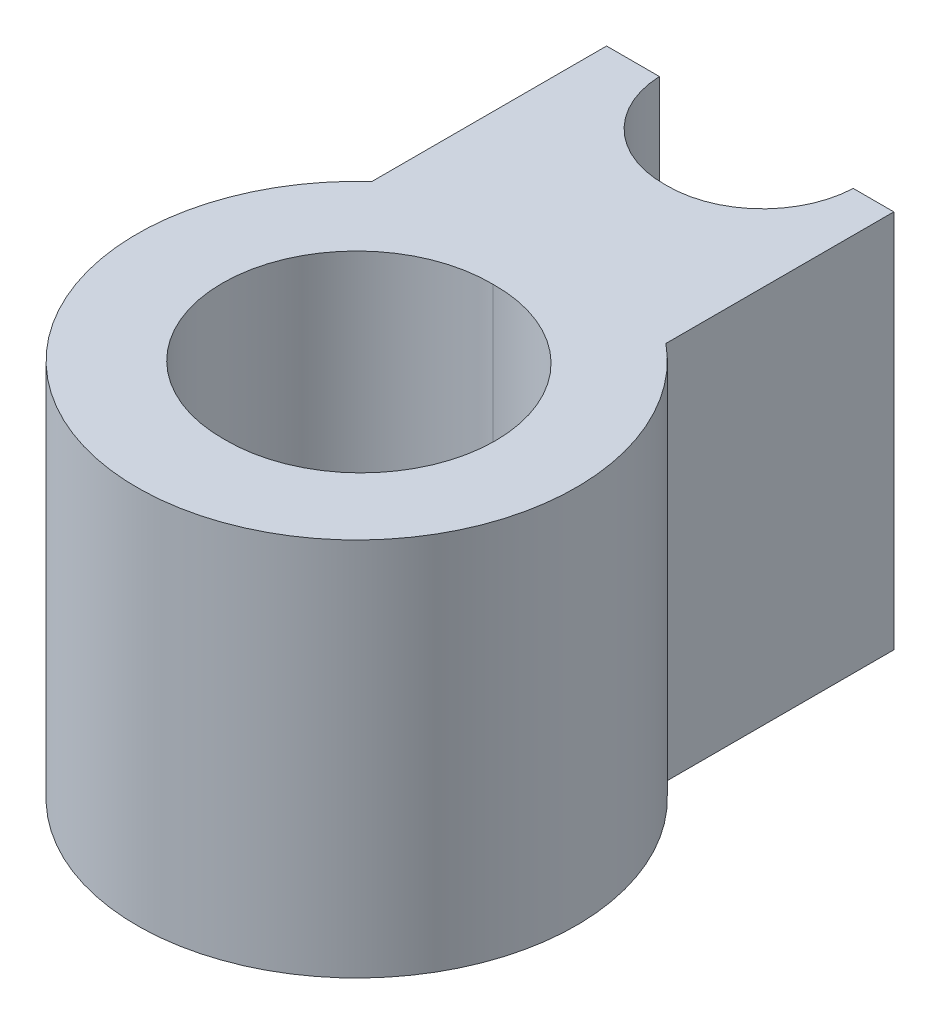
ISO-10303-21;
HEADER;
FILE_DESCRIPTION(('STEP AP214'),'2;1');
FILE_NAME('part.step','',(''),(''),'','','');
FILE_SCHEMA(('AUTOMOTIVE_DESIGN { 1 0 10303 214 1 1 1 1 }'));
ENDSEC;
DATA;
#1=APPLICATION_CONTEXT('core data for automotive mechanical design processes');
#2=APPLICATION_PROTOCOL_DEFINITION('international standard','automotive_design',2000,#1);
#3=PRODUCT_CONTEXT('',#1,'mechanical');
#4=PRODUCT('Part','Part','',(#3));
#5=PRODUCT_RELATED_PRODUCT_CATEGORY('part','',(#4));
#6=PRODUCT_DEFINITION_FORMATION('','',#4);
#7=PRODUCT_DEFINITION_CONTEXT('part definition',#1,'design');
#8=PRODUCT_DEFINITION('design','',#6,#7);
#9=PRODUCT_DEFINITION_SHAPE('','',#8);
#10=(LENGTH_UNIT() NAMED_UNIT(*) SI_UNIT(.MILLI.,.METRE.));
#11=(NAMED_UNIT(*) PLANE_ANGLE_UNIT() SI_UNIT($,.RADIAN.));
#12=(NAMED_UNIT(*) SI_UNIT($,.STERADIAN.) SOLID_ANGLE_UNIT());
#13=UNCERTAINTY_MEASURE_WITH_UNIT(LENGTH_MEASURE(1.E-05),#10,'distance_accuracy_value','');
#14=(GEOMETRIC_REPRESENTATION_CONTEXT(3) GLOBAL_UNCERTAINTY_ASSIGNED_CONTEXT((#13)) GLOBAL_UNIT_ASSIGNED_CONTEXT((#10,
#11,#12)) REPRESENTATION_CONTEXT('',''));
#15=CARTESIAN_POINT('',(0.,0.,0.));
#16=DIRECTION('',(0.,0.,1.));
#17=DIRECTION('',(1.,0.,0.));
#18=AXIS2_PLACEMENT_3D('',#15,#16,#17);
#19=CARTESIAN_POINT('',(1.26536763995187,2.87183105039429,15.59112871048));
#20=DIRECTION('',(0.,1.,0.));
#21=DIRECTION('',(0.,0.,-1.));
#22=AXIS2_PLACEMENT_3D('',#19,#20,#21);
#23=PLANE('',#22);
#24=CARTESIAN_POINT('',(1.17646763995186,2.87183105039429,7.9584287104753));
#25=DIRECTION('',(0.,1.,0.));
#26=DIRECTION('',(0.,0.,1.));
#27=AXIS2_PLACEMENT_3D('',#24,#25,#26);
#28=CIRCLE('',#27,0.425);
#29=CARTESIAN_POINT('',(1.16954280388208,2.87183105039429,8.38337229101912));
#30=VERTEX_POINT('',#29);
#31=CARTESIAN_POINT('',(1.16954280388209,2.87183105039429,7.53348512993148));
#32=VERTEX_POINT('',#31);
#33=EDGE_CURVE('E122',#30,#32,#28,.T.);
#34=ORIENTED_EDGE('',*,*,#33,.F.);
#35=CARTESIAN_POINT('',(1.16261796781224,2.87183105039429,7.9584287104753));
#36=DIRECTION('',(0.,1.,0.));
#37=DIRECTION('',(0.,0.,1.));
#38=AXIS2_PLACEMENT_3D('',#35,#36,#37);
#39=CIRCLE('',#38,0.425);
#40=EDGE_CURVE('E116',#32,#30,#39,.T.);
#41=ORIENTED_EDGE('',*,*,#40,.F.);
#42=EDGE_LOOP('',(#34,#41));
#43=FACE_BOUND('',#42,.T.);
#44=DIRECTION('',(-5.26442008312743E-13,0.,1.));
#45=VECTOR('',#44,1.);
#46=CARTESIAN_POINT('',(0.695803163929619,2.87183105039428,6.70112871047543));
#47=LINE('',#46,#45);
#48=CARTESIAN_POINT('',(0.695803163929619,2.87183105039428,6.70112871047543));
#49=VERTEX_POINT('',#48);
#50=CARTESIAN_POINT('',(0.695803163929228,2.87183105039428,7.44378108328629));
#51=VERTEX_POINT('',#50);
#52=EDGE_CURVE('E172',#49,#51,#47,.T.);
#53=ORIENTED_EDGE('',*,*,#52,.T.);
#54=CARTESIAN_POINT('',(1.16261796781224,2.87183105039429,7.9584287104753));
#55=DIRECTION('',(0.,1.,0.));
#56=DIRECTION('',(0.,0.,1.));
#57=AXIS2_PLACEMENT_3D('',#54,#55,#56);
#58=CIRCLE('',#57,0.694822453073876);
#59=CARTESIAN_POINT('',(1.60449705669173,2.87183105039429,7.42221875895759));
#60=VERTEX_POINT('',#59);
#61=EDGE_CURVE('E149',#51,#60,#58,.T.);
#62=ORIENTED_EDGE('',*,*,#61,.T.);
#63=DIRECTION('',(5.91001814819049E-13,0.,1.));
#64=VECTOR('',#63,1.);
#65=CARTESIAN_POINT('',(1.6044970566913,2.87183105039428,6.70112871047504));
#66=LINE('',#65,#64);
#67=CARTESIAN_POINT('',(1.6044970566913,2.87183105039428,6.70112871047504));
#68=VERTEX_POINT('',#67);
#69=EDGE_CURVE('E20',#68,#60,#66,.T.);
#70=ORIENTED_EDGE('',*,*,#69,.F.);
#71=DIRECTION('',(-1.,0.,1.62432664225037E-12));
#72=VECTOR('',#71,1.);
#73=CARTESIAN_POINT('',(1.6044970566913,2.87183105039428,6.70112871047504));
#74=LINE('',#73,#72);
#75=CARTESIAN_POINT('',(1.47619870275188,2.87183105039428,6.70112871047525));
#76=VERTEX_POINT('',#75);
#77=EDGE_CURVE('E11',#68,#76,#74,.T.);
#78=ORIENTED_EDGE('',*,*,#77,.T.);
#79=CARTESIAN_POINT('',(1.17646763995184,2.87183105039428,6.68842871047527));
#80=DIRECTION('',(0.,1.,0.));
#81=DIRECTION('',(-0.999103542626009,0.,0.0423333333457055));
#82=AXIS2_PLACEMENT_3D('',#79,#80,#81);
#83=CIRCLE('',#82,0.299999999999993);
#84=CARTESIAN_POINT('',(1.16954280388336,2.87183105039429,6.9883487775688));
#85=VERTEX_POINT('',#84);
#86=EDGE_CURVE('E158',#85,#76,#83,.T.);
#87=ORIENTED_EDGE('',*,*,#86,.F.);
#88=CARTESIAN_POINT('',(1.16261796781224,2.87183105039428,6.68842871047527));
#89=DIRECTION('',(0.,1.,0.));
#90=DIRECTION('',(-0.999103542626486,0.,0.0423333333344528));
#91=AXIS2_PLACEMENT_3D('',#88,#89,#90);
#92=CIRCLE('',#91,0.30000000000001);
#93=CARTESIAN_POINT('',(0.862886905024283,2.87183105039428,6.70112871047561));
#94=VERTEX_POINT('',#93);
#95=EDGE_CURVE('E162',#94,#85,#92,.T.);
#96=ORIENTED_EDGE('',*,*,#95,.F.);
#97=DIRECTION('',(1.,0.,1.06337566312118E-12));
#98=VECTOR('',#97,1.);
#99=CARTESIAN_POINT('',(0.695803163929619,2.87183105039428,6.70112871047543));
#100=LINE('',#99,#98);
#101=EDGE_CURVE('E168',#49,#94,#100,.T.);
#102=ORIENTED_EDGE('',*,*,#101,.F.);
#103=EDGE_LOOP('',(#53,#62,#70,#78,#87,#96,#102));
#104=FACE_BOUND('',#103,.T.);
#105=ADVANCED_FACE('F17',(#43,#104),#23,.T.);
#106=CARTESIAN_POINT('',(1.47619870275188,2.87183105039428,6.70112871047525));
#107=DIRECTION('',(-1.62432664225037E-12,0.,-1.));
#108=DIRECTION('',(-1.,0.,1.62432664225037E-12));
#109=AXIS2_PLACEMENT_3D('',#106,#107,#108);
#110=PLANE('',#109);
#111=DIRECTION('',(-1.,0.,1.62432664225037E-12));
#112=VECTOR('',#111,1.);
#113=CARTESIAN_POINT('',(1.37078317134466,1.6718310055699,6.70112871047543));
#114=LINE('',#113,#112);
#115=CARTESIAN_POINT('',(1.60449705669131,1.6718310055699,6.70112871047504));
#116=VERTEX_POINT('',#115);
#117=CARTESIAN_POINT('',(1.47619870275189,1.6718310055699,6.70112871047526));
#118=VERTEX_POINT('',#117);
#119=EDGE_CURVE('E346',#116,#118,#114,.T.);
#120=ORIENTED_EDGE('',*,*,#119,.T.);
#121=DIRECTION('',(0.,-1.,0.));
#122=VECTOR('',#121,1.);
#123=CARTESIAN_POINT('',(1.47619870275188,2.87183105039428,6.70112871047525));
#124=LINE('',#123,#122);
#125=EDGE_CURVE('E154',#76,#118,#124,.T.);
#126=ORIENTED_EDGE('',*,*,#125,.F.);
#127=ORIENTED_EDGE('',*,*,#77,.F.);
#128=DIRECTION('',(0.,-1.,0.));
#129=VECTOR('',#128,1.);
#130=CARTESIAN_POINT('',(1.6044970566913,2.87183105039428,6.70112871047504));
#131=LINE('',#130,#129);
#132=EDGE_CURVE('E152',#68,#116,#131,.T.);
#133=ORIENTED_EDGE('',*,*,#132,.T.);
#134=EDGE_LOOP('',(#120,#126,#127,#133));
#135=FACE_BOUND('',#134,.T.);
#136=ADVANCED_FACE('F284',(#135),#110,.T.);
#137=CARTESIAN_POINT('',(1.6044970566913,2.87183105039428,6.70112871047504));
#138=DIRECTION('',(1.,0.,-5.91001814819049E-13));
#139=DIRECTION('',(-5.91001814819049E-13,0.,-1.));
#140=AXIS2_PLACEMENT_3D('',#137,#138,#139);
#141=PLANE('',#140);
#142=DIRECTION('',(-5.91001814819049E-13,0.,-1.));
#143=VECTOR('',#142,1.);
#144=CARTESIAN_POINT('',(1.60449705669393,1.6718310055699,11.1461287104774));
#145=LINE('',#144,#143);
#146=CARTESIAN_POINT('',(1.60449705669174,1.6718310055699,7.42221875895759));
#147=VERTEX_POINT('',#146);
#148=EDGE_CURVE('E140',#147,#116,#145,.T.);
#149=ORIENTED_EDGE('',*,*,#148,.T.);
#150=ORIENTED_EDGE('',*,*,#132,.F.);
#151=ORIENTED_EDGE('',*,*,#69,.T.);
#152=DIRECTION('',(0.,-1.,0.));
#153=VECTOR('',#152,1.);
#154=CARTESIAN_POINT('',(1.60449705669173,2.87183105039429,7.42221875895759));
#155=LINE('',#154,#153);
#156=EDGE_CURVE('E153',#60,#147,#155,.T.);
#157=ORIENTED_EDGE('',*,*,#156,.T.);
#158=EDGE_LOOP('',(#149,#150,#151,#157));
#159=FACE_BOUND('',#158,.T.);
#160=ADVANCED_FACE('F273',(#159),#141,.T.);
#161=CARTESIAN_POINT('',(1.16261796781224,2.87183105039429,7.9584287104753));
#162=DIRECTION('',(0.,-1.,0.));
#163=DIRECTION('',(0.,0.,1.));
#164=AXIS2_PLACEMENT_3D('',#161,#162,#163);
#165=CYLINDRICAL_SURFACE('',#164,0.694822453073876);
#166=CARTESIAN_POINT('',(1.16261796781224,1.6718310055699,7.9584287104753));
#167=DIRECTION('',(0.,1.,0.));
#168=DIRECTION('',(0.,0.,1.));
#169=AXIS2_PLACEMENT_3D('',#166,#167,#168);
#170=CIRCLE('',#169,0.694822453073876);
#171=CARTESIAN_POINT('',(0.695803163929236,1.6718310055699,7.44378108328629));
#172=VERTEX_POINT('',#171);
#173=EDGE_CURVE('E133',#172,#147,#170,.T.);
#174=ORIENTED_EDGE('',*,*,#173,.T.);
#175=ORIENTED_EDGE('',*,*,#156,.F.);
#176=ORIENTED_EDGE('',*,*,#61,.F.);
#177=DIRECTION('',(0.,-1.,0.));
#178=VECTOR('',#177,1.);
#179=CARTESIAN_POINT('',(0.695803163929228,2.87183105039428,7.44378108328629));
#180=LINE('',#179,#178);
#181=EDGE_CURVE('E171',#51,#172,#180,.T.);
#182=ORIENTED_EDGE('',*,*,#181,.T.);
#183=EDGE_LOOP('',(#174,#175,#176,#182));
#184=FACE_BOUND('',#183,.T.);
#185=ADVANCED_FACE('F263',(#184),#165,.T.);
#186=CARTESIAN_POINT('',(1.16261796781224,2.87183105039429,7.9584287104753));
#187=DIRECTION('',(0.,-1.,0.));
#188=DIRECTION('',(-1.,0.,0.));
#189=AXIS2_PLACEMENT_3D('',#186,#187,#188);
#190=CYLINDRICAL_SURFACE('',#189,0.425);
#191=CARTESIAN_POINT('',(1.16261796781224,1.6718310055699,7.9584287104753));
#192=DIRECTION('',(0.,-1.,0.));
#193=DIRECTION('',(0.,0.,1.));
#194=AXIS2_PLACEMENT_3D('',#191,#192,#193);
#195=CIRCLE('',#194,0.425);
#196=CARTESIAN_POINT('',(1.16954280388209,1.6718310055699,8.38337229101912));
#197=VERTEX_POINT('',#196);
#198=CARTESIAN_POINT('',(1.16954280388209,1.6718310055699,7.53348512993148));
#199=VERTEX_POINT('',#198);
#200=EDGE_CURVE('E114',#197,#199,#195,.T.);
#201=ORIENTED_EDGE('',*,*,#200,.T.);
#202=DIRECTION('',(0.,-1.,0.));
#203=VECTOR('',#202,1.);
#204=CARTESIAN_POINT('',(1.16954280388209,2.87183105039429,7.53348512993148));
#205=LINE('',#204,#203);
#206=EDGE_CURVE('E131',#32,#199,#205,.T.);
#207=ORIENTED_EDGE('',*,*,#206,.F.);
#208=ORIENTED_EDGE('',*,*,#40,.T.);
#209=DIRECTION('',(0.,-1.,0.));
#210=VECTOR('',#209,1.);
#211=CARTESIAN_POINT('',(1.16954280388208,2.87183105039429,8.38337229101912));
#212=LINE('',#211,#210);
#213=EDGE_CURVE('E110',#30,#197,#212,.T.);
#214=ORIENTED_EDGE('',*,*,#213,.T.);
#215=EDGE_LOOP('',(#201,#207,#208,#214));
#216=FACE_BOUND('',#215,.T.);
#217=ADVANCED_FACE('F112',(#216),#190,.F.);
#218=CARTESIAN_POINT('',(0.695803163929228,2.87183105039428,7.44378108328629));
#219=DIRECTION('',(-1.,0.,-5.26442008312743E-13));
#220=DIRECTION('',(-5.26442008312743E-13,0.,1.));
#221=AXIS2_PLACEMENT_3D('',#218,#219,#220);
#222=PLANE('',#221);
#223=DIRECTION('',(-5.26442008312743E-13,0.,1.));
#224=VECTOR('',#223,1.);
#225=CARTESIAN_POINT('',(0.695803163927084,1.6718310055699,11.517454896883));
#226=LINE('',#225,#224);
#227=CARTESIAN_POINT('',(0.695803163929627,1.6718310055699,6.70112871047543));
#228=VERTEX_POINT('',#227);
#229=EDGE_CURVE('E330',#228,#172,#226,.T.);
#230=ORIENTED_EDGE('',*,*,#229,.T.);
#231=ORIENTED_EDGE('',*,*,#181,.F.);
#232=ORIENTED_EDGE('',*,*,#52,.F.);
#233=DIRECTION('',(0.,-1.,0.));
#234=VECTOR('',#233,1.);
#235=CARTESIAN_POINT('',(0.695803163929619,2.87183105039428,6.70112871047543));
#236=LINE('',#235,#234);
#237=EDGE_CURVE('E165',#49,#228,#236,.T.);
#238=ORIENTED_EDGE('',*,*,#237,.T.);
#239=EDGE_LOOP('',(#230,#231,#232,#238));
#240=FACE_BOUND('',#239,.T.);
#241=ADVANCED_FACE('F243',(#240),#222,.T.);
#242=CARTESIAN_POINT('',(0.695803163929619,2.87183105039428,6.70112871047543));
#243=DIRECTION('',(1.06337566312118E-12,0.,-1.));
#244=DIRECTION('',(0.,-1.,0.));
#245=AXIS2_PLACEMENT_3D('',#242,#243,#244);
#246=PLANE('',#245);
#247=DIRECTION('',(-1.,0.,-1.06337566312118E-12));
#248=VECTOR('',#247,1.);
#249=CARTESIAN_POINT('',(0.980585401945474,1.6718310055699,6.70112871047574));
#250=LINE('',#249,#248);
#251=CARTESIAN_POINT('',(0.862886905024292,1.6718310055699,6.70112871047561));
#252=VERTEX_POINT('',#251);
#253=EDGE_CURVE('E339',#252,#228,#250,.T.);
#254=ORIENTED_EDGE('',*,*,#253,.T.);
#255=ORIENTED_EDGE('',*,*,#237,.F.);
#256=ORIENTED_EDGE('',*,*,#101,.T.);
#257=DIRECTION('',(0.,-1.,0.));
#258=VECTOR('',#257,1.);
#259=CARTESIAN_POINT('',(0.862886905024283,2.87183105039428,6.70112871047561));
#260=LINE('',#259,#258);
#261=EDGE_CURVE('E157',#94,#252,#260,.T.);
#262=ORIENTED_EDGE('',*,*,#261,.T.);
#263=EDGE_LOOP('',(#254,#255,#256,#262));
#264=FACE_BOUND('',#263,.T.);
#265=ADVANCED_FACE('F232',(#264),#246,.T.);
#266=CARTESIAN_POINT('',(1.16261796781224,2.87183105039428,6.68842871047527));
#267=DIRECTION('',(0.,-1.,0.));
#268=DIRECTION('',(-0.999103542626486,0.,0.0423333333344528));
#269=AXIS2_PLACEMENT_3D('',#266,#267,#268);
#270=CYLINDRICAL_SURFACE('',#269,0.30000000000001);
#271=CARTESIAN_POINT('',(1.16261796781224,1.6718310055699,6.68842871047527));
#272=DIRECTION('',(0.,-1.,0.));
#273=DIRECTION('',(-0.999103542626486,0.,0.0423333333344528));
#274=AXIS2_PLACEMENT_3D('',#271,#272,#273);
#275=CIRCLE('',#274,0.30000000000001);
#276=CARTESIAN_POINT('',(1.16954280388337,1.6718310055699,6.98834877756881));
#277=VERTEX_POINT('',#276);
#278=EDGE_CURVE('E343',#277,#252,#275,.T.);
#279=ORIENTED_EDGE('',*,*,#278,.T.);
#280=ORIENTED_EDGE('',*,*,#261,.F.);
#281=ORIENTED_EDGE('',*,*,#95,.T.);
#282=DIRECTION('',(0.,-1.,0.));
#283=VECTOR('',#282,1.);
#284=CARTESIAN_POINT('',(1.16954280388336,2.87183105039429,6.9883487775688));
#285=LINE('',#284,#283);
#286=EDGE_CURVE('E148',#85,#277,#285,.T.);
#287=ORIENTED_EDGE('',*,*,#286,.T.);
#288=EDGE_LOOP('',(#279,#280,#281,#287));
#289=FACE_BOUND('',#288,.T.);
#290=ADVANCED_FACE('F221',(#289),#270,.F.);
#291=CARTESIAN_POINT('',(1.17646763995184,2.87183105039428,6.68842871047527));
#292=DIRECTION('',(0.,-1.,0.));
#293=DIRECTION('',(-0.999103542626009,0.,0.0423333333457054));
#294=AXIS2_PLACEMENT_3D('',#291,#292,#293);
#295=CYLINDRICAL_SURFACE('',#294,0.299999999999993);
#296=CARTESIAN_POINT('',(1.17646763995184,1.6718310055699,6.68842871047527));
#297=DIRECTION('',(0.,-1.,0.));
#298=DIRECTION('',(-0.999103542626009,0.,0.0423333333457055));
#299=AXIS2_PLACEMENT_3D('',#296,#297,#298);
#300=CIRCLE('',#299,0.299999999999993);
#301=EDGE_CURVE('E349',#118,#277,#300,.T.);
#302=ORIENTED_EDGE('',*,*,#301,.T.);
#303=ORIENTED_EDGE('',*,*,#286,.F.);
#304=ORIENTED_EDGE('',*,*,#86,.T.);
#305=ORIENTED_EDGE('',*,*,#125,.T.);
#306=EDGE_LOOP('',(#302,#303,#304,#305));
#307=FACE_BOUND('',#306,.T.);
#308=ADVANCED_FACE('F211',(#307),#295,.F.);
#309=CARTESIAN_POINT('',(1.17646763995186,2.87183105039429,7.9584287104753));
#310=DIRECTION('',(0.,-1.,0.));
#311=DIRECTION('',(1.,0.,0.));
#312=AXIS2_PLACEMENT_3D('',#309,#310,#311);
#313=CYLINDRICAL_SURFACE('',#312,0.425);
#314=CARTESIAN_POINT('',(1.17646763995186,1.6718310055699,7.9584287104753));
#315=DIRECTION('',(0.,-1.,0.));
#316=DIRECTION('',(0.,0.,1.));
#317=AXIS2_PLACEMENT_3D('',#314,#315,#316);
#318=CIRCLE('',#317,0.425);
#319=EDGE_CURVE('E127',#199,#197,#318,.T.);
#320=ORIENTED_EDGE('',*,*,#319,.T.);
#321=ORIENTED_EDGE('',*,*,#213,.F.);
#322=ORIENTED_EDGE('',*,*,#33,.T.);
#323=ORIENTED_EDGE('',*,*,#206,.T.);
#324=EDGE_LOOP('',(#320,#321,#322,#323));
#325=FACE_BOUND('',#324,.T.);
#326=ADVANCED_FACE('F130',(#325),#313,.F.);
#327=CARTESIAN_POINT('',(1.26536763995188,1.6718310055699,15.59112871048));
#328=DIRECTION('',(0.,1.,0.));
#329=DIRECTION('',(0.,0.,-1.));
#330=AXIS2_PLACEMENT_3D('',#327,#328,#329);
#331=PLANE('',#330);
#332=ORIENTED_EDGE('',*,*,#319,.F.);
#333=ORIENTED_EDGE('',*,*,#200,.F.);
#334=EDGE_LOOP('',(#332,#333));
#335=FACE_BOUND('',#334,.T.);
#336=ORIENTED_EDGE('',*,*,#229,.F.);
#337=ORIENTED_EDGE('',*,*,#253,.F.);
#338=ORIENTED_EDGE('',*,*,#278,.F.);
#339=ORIENTED_EDGE('',*,*,#301,.F.);
#340=ORIENTED_EDGE('',*,*,#119,.F.);
#341=ORIENTED_EDGE('',*,*,#148,.F.);
#342=ORIENTED_EDGE('',*,*,#173,.F.);
#343=EDGE_LOOP('',(#336,#337,#338,#339,#340,#341,#342));
#344=FACE_BOUND('',#343,.T.);
#345=ADVANCED_FACE('F125',(#335,#344),#331,.F.);
#346=CLOSED_SHELL('',(#105,#136,#160,#185,#217,#241,#265,#290,#308,#326,#345));
#347=MANIFOLD_SOLID_BREP('B1',#346);
#348=ADVANCED_BREP_SHAPE_REPRESENTATION('',(#18,#347),#14);
#349=SHAPE_DEFINITION_REPRESENTATION(#9,#348);
ENDSEC;
END-ISO-10303-21;
